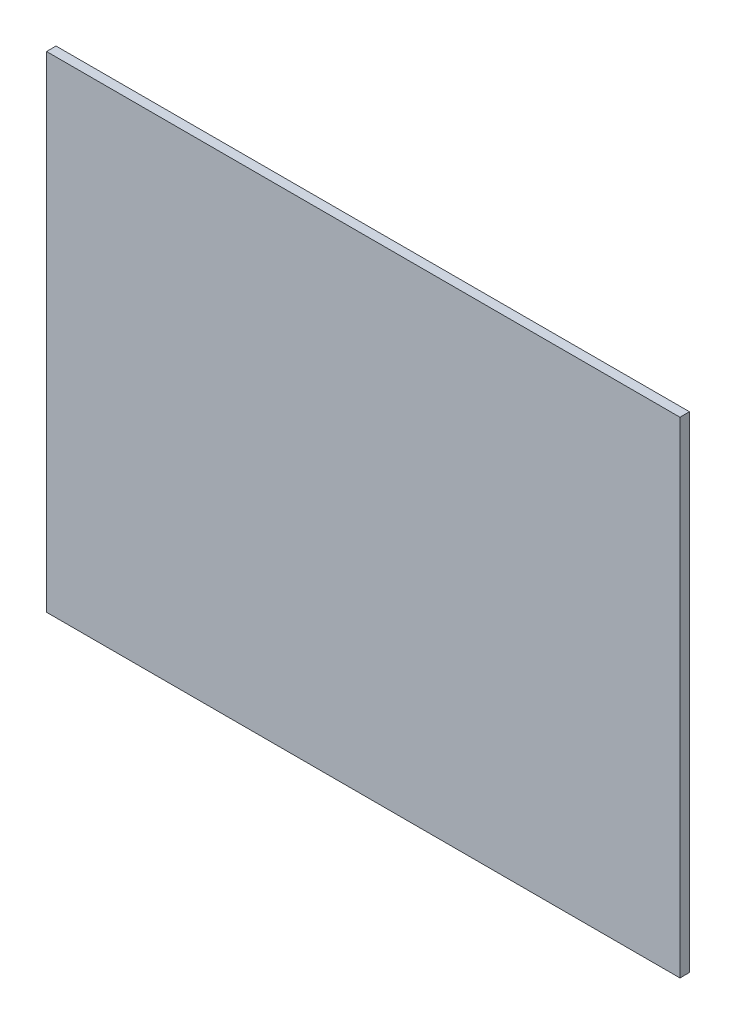
ISO-10303-21;
HEADER;
FILE_DESCRIPTION(('STEP AP214'),'2;1');
FILE_NAME('part.step','',(''),(''),'','','');
FILE_SCHEMA(('AUTOMOTIVE_DESIGN { 1 0 10303 214 1 1 1 1 }'));
ENDSEC;
DATA;
#1=APPLICATION_CONTEXT('core data for automotive mechanical design processes');
#2=APPLICATION_PROTOCOL_DEFINITION('international standard','automotive_design',2000,#1);
#3=PRODUCT_CONTEXT('',#1,'mechanical');
#4=PRODUCT('Part','Part','',(#3));
#5=PRODUCT_RELATED_PRODUCT_CATEGORY('part','',(#4));
#6=PRODUCT_DEFINITION_FORMATION('','',#4);
#7=PRODUCT_DEFINITION_CONTEXT('part definition',#1,'design');
#8=PRODUCT_DEFINITION('design','',#6,#7);
#9=PRODUCT_DEFINITION_SHAPE('','',#8);
#10=(LENGTH_UNIT() NAMED_UNIT(*) SI_UNIT(.MILLI.,.METRE.));
#11=(NAMED_UNIT(*) PLANE_ANGLE_UNIT() SI_UNIT($,.RADIAN.));
#12=(NAMED_UNIT(*) SI_UNIT($,.STERADIAN.) SOLID_ANGLE_UNIT());
#13=UNCERTAINTY_MEASURE_WITH_UNIT(LENGTH_MEASURE(1.E-05),#10,'distance_accuracy_value','');
#14=(GEOMETRIC_REPRESENTATION_CONTEXT(3) GLOBAL_UNCERTAINTY_ASSIGNED_CONTEXT((#13)) GLOBAL_UNIT_ASSIGNED_CONTEXT((#10,
#11,#12)) REPRESENTATION_CONTEXT('',''));
#15=CARTESIAN_POINT('',(0.,0.,0.));
#16=DIRECTION('',(0.,0.,1.));
#17=DIRECTION('',(1.,0.,0.));
#18=AXIS2_PLACEMENT_3D('',#15,#16,#17);
#19=CARTESIAN_POINT('',(-15.,-18.25,0.));
#20=DIRECTION('',(0.,0.,-1.));
#21=DIRECTION('',(-1.,0.,0.));
#22=AXIS2_PLACEMENT_3D('',#19,#20,#21);
#23=PLANE('',#22);
#24=DIRECTION('',(0.,1.,0.));
#25=VECTOR('',#24,1.);
#26=CARTESIAN_POINT('',(15.,-18.25,0.));
#27=LINE('',#26,#25);
#28=CARTESIAN_POINT('',(15.,4.75,0.));
#29=VERTEX_POINT('',#28);
#30=CARTESIAN_POINT('',(15.,-18.25,0.));
#31=VERTEX_POINT('',#30);
#32=EDGE_CURVE('E55',#29,#31,#27,.F.);
#33=ORIENTED_EDGE('',*,*,#32,.T.);
#34=DIRECTION('',(-1.,0.,0.));
#35=VECTOR('',#34,1.);
#36=CARTESIAN_POINT('',(-15.,-18.25,0.));
#37=LINE('',#36,#35);
#38=CARTESIAN_POINT('',(-15.,-18.25,0.));
#39=VERTEX_POINT('',#38);
#40=EDGE_CURVE('E76',#31,#39,#37,.T.);
#41=ORIENTED_EDGE('',*,*,#40,.T.);
#42=DIRECTION('',(0.,1.,0.));
#43=VECTOR('',#42,1.);
#44=CARTESIAN_POINT('',(-15.,-18.25,0.));
#45=LINE('',#44,#43);
#46=CARTESIAN_POINT('',(-15.,4.75,0.));
#47=VERTEX_POINT('',#46);
#48=EDGE_CURVE('E58',#39,#47,#45,.T.);
#49=ORIENTED_EDGE('',*,*,#48,.T.);
#50=DIRECTION('',(1.,0.,0.));
#51=VECTOR('',#50,1.);
#52=CARTESIAN_POINT('',(15.,4.75,0.));
#53=LINE('',#52,#51);
#54=EDGE_CURVE('E20',#47,#29,#53,.T.);
#55=ORIENTED_EDGE('',*,*,#54,.T.);
#56=EDGE_LOOP('',(#33,#41,#49,#55));
#57=FACE_BOUND('',#56,.T.);
#58=ADVANCED_FACE('F17',(#57),#23,.T.);
#59=CARTESIAN_POINT('',(15.,4.75,0.45));
#60=DIRECTION('',(0.,-1.,0.));
#61=DIRECTION('',(1.,0.,0.));
#62=AXIS2_PLACEMENT_3D('',#59,#60,#61);
#63=PLANE('',#62);
#64=DIRECTION('',(0.,0.,1.));
#65=VECTOR('',#64,1.);
#66=CARTESIAN_POINT('',(-15.,4.75,0.45));
#67=LINE('',#66,#65);
#68=CARTESIAN_POINT('',(-15.,4.75,0.45));
#69=VERTEX_POINT('',#68);
#70=EDGE_CURVE('E78',#47,#69,#67,.T.);
#71=ORIENTED_EDGE('',*,*,#70,.T.);
#72=DIRECTION('',(-1.,0.,0.));
#73=VECTOR('',#72,1.);
#74=CARTESIAN_POINT('',(-15.,4.75,0.45));
#75=LINE('',#74,#73);
#76=CARTESIAN_POINT('',(15.,4.75,0.45));
#77=VERTEX_POINT('',#76);
#78=EDGE_CURVE('E73',#69,#77,#75,.F.);
#79=ORIENTED_EDGE('',*,*,#78,.T.);
#80=DIRECTION('',(0.,0.,1.));
#81=VECTOR('',#80,1.);
#82=CARTESIAN_POINT('',(15.,4.75,0.45));
#83=LINE('',#82,#81);
#84=EDGE_CURVE('E63',#77,#29,#83,.F.);
#85=ORIENTED_EDGE('',*,*,#84,.T.);
#86=ORIENTED_EDGE('',*,*,#54,.F.);
#87=EDGE_LOOP('',(#71,#79,#85,#86));
#88=FACE_BOUND('',#87,.T.);
#89=ADVANCED_FACE('F72',(#88),#63,.F.);
#90=CARTESIAN_POINT('',(15.,-18.25,0.45));
#91=DIRECTION('',(-1.,0.,0.));
#92=DIRECTION('',(0.,0.,1.));
#93=AXIS2_PLACEMENT_3D('',#90,#91,#92);
#94=PLANE('',#93);
#95=ORIENTED_EDGE('',*,*,#84,.F.);
#96=DIRECTION('',(0.,1.,0.));
#97=VECTOR('',#96,1.);
#98=CARTESIAN_POINT('',(15.,-18.25,0.45));
#99=LINE('',#98,#97);
#100=CARTESIAN_POINT('',(15.,-18.25,0.45));
#101=VERTEX_POINT('',#100);
#102=EDGE_CURVE('E83',#77,#101,#99,.F.);
#103=ORIENTED_EDGE('',*,*,#102,.T.);
#104=DIRECTION('',(0.,0.,1.));
#105=VECTOR('',#104,1.);
#106=CARTESIAN_POINT('',(15.,-18.25,0.45));
#107=LINE('',#106,#105);
#108=EDGE_CURVE('E69',#101,#31,#107,.F.);
#109=ORIENTED_EDGE('',*,*,#108,.T.);
#110=ORIENTED_EDGE('',*,*,#32,.F.);
#111=EDGE_LOOP('',(#95,#103,#109,#110));
#112=FACE_BOUND('',#111,.T.);
#113=ADVANCED_FACE('F66',(#112),#94,.F.);
#114=CARTESIAN_POINT('',(-15.,-18.25,0.45));
#115=DIRECTION('',(0.,1.,0.));
#116=DIRECTION('',(-1.,0.,0.));
#117=AXIS2_PLACEMENT_3D('',#114,#115,#116);
#118=PLANE('',#117);
#119=ORIENTED_EDGE('',*,*,#108,.F.);
#120=DIRECTION('',(-1.,0.,0.));
#121=VECTOR('',#120,1.);
#122=CARTESIAN_POINT('',(-15.,-18.25,0.45));
#123=LINE('',#122,#121);
#124=CARTESIAN_POINT('',(-15.,-18.25,0.45));
#125=VERTEX_POINT('',#124);
#126=EDGE_CURVE('E26',#101,#125,#123,.T.);
#127=ORIENTED_EDGE('',*,*,#126,.T.);
#128=DIRECTION('',(0.,0.,1.));
#129=VECTOR('',#128,1.);
#130=CARTESIAN_POINT('',(-15.,-18.25,0.45));
#131=LINE('',#130,#129);
#132=EDGE_CURVE('E34',#125,#39,#131,.F.);
#133=ORIENTED_EDGE('',*,*,#132,.T.);
#134=ORIENTED_EDGE('',*,*,#40,.F.);
#135=EDGE_LOOP('',(#119,#127,#133,#134));
#136=FACE_BOUND('',#135,.T.);
#137=ADVANCED_FACE('F88',(#136),#118,.F.);
#138=CARTESIAN_POINT('',(-15.,-18.25,0.45));
#139=DIRECTION('',(1.,0.,0.));
#140=DIRECTION('',(0.,1.,0.));
#141=AXIS2_PLACEMENT_3D('',#138,#139,#140);
#142=PLANE('',#141);
#143=ORIENTED_EDGE('',*,*,#132,.F.);
#144=DIRECTION('',(0.,1.,0.));
#145=VECTOR('',#144,1.);
#146=CARTESIAN_POINT('',(-15.,-18.25,0.45));
#147=LINE('',#146,#145);
#148=EDGE_CURVE('E11',#125,#69,#147,.T.);
#149=ORIENTED_EDGE('',*,*,#148,.T.);
#150=ORIENTED_EDGE('',*,*,#70,.F.);
#151=ORIENTED_EDGE('',*,*,#48,.F.);
#152=EDGE_LOOP('',(#143,#149,#150,#151));
#153=FACE_BOUND('',#152,.T.);
#154=ADVANCED_FACE('F91',(#153),#142,.F.);
#155=CARTESIAN_POINT('',(-15.,-18.25,0.45));
#156=DIRECTION('',(0.,0.,-1.));
#157=DIRECTION('',(-1.,0.,0.));
#158=AXIS2_PLACEMENT_3D('',#155,#156,#157);
#159=PLANE('',#158);
#160=ORIENTED_EDGE('',*,*,#126,.F.);
#161=ORIENTED_EDGE('',*,*,#102,.F.);
#162=ORIENTED_EDGE('',*,*,#78,.F.);
#163=ORIENTED_EDGE('',*,*,#148,.F.);
#164=EDGE_LOOP('',(#160,#161,#162,#163));
#165=FACE_BOUND('',#164,.T.);
#166=ADVANCED_FACE('F90',(#165),#159,.F.);
#167=CLOSED_SHELL('',(#58,#89,#113,#137,#154,#166));
#168=MANIFOLD_SOLID_BREP('B1',#167);
#169=ADVANCED_BREP_SHAPE_REPRESENTATION('',(#18,#168),#14);
#170=SHAPE_DEFINITION_REPRESENTATION(#9,#169);
ENDSEC;
END-ISO-10303-21;
